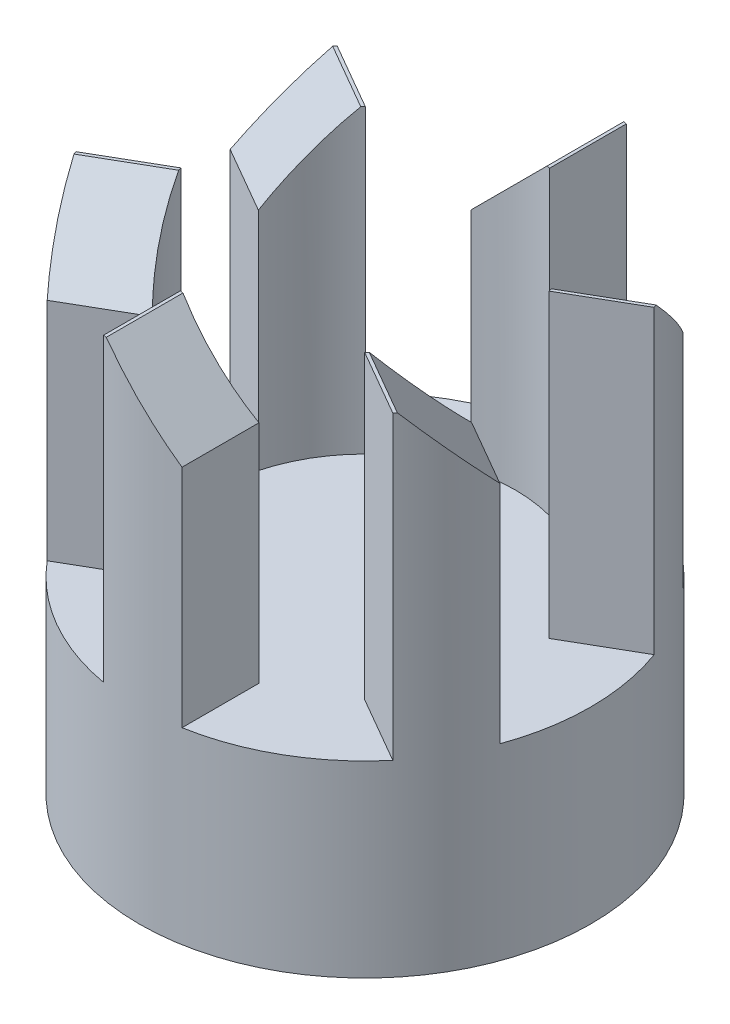
ISO-10303-21;
HEADER;
FILE_DESCRIPTION(('STEP AP214'),'2;1');
FILE_NAME('part.step','',(''),(''),'','','');
FILE_SCHEMA(('AUTOMOTIVE_DESIGN { 1 0 10303 214 1 1 1 1 }'));
ENDSEC;
DATA;
#1=APPLICATION_CONTEXT('core data for automotive mechanical design processes');
#2=APPLICATION_PROTOCOL_DEFINITION('international standard','automotive_design',2000,#1);
#3=PRODUCT_CONTEXT('',#1,'mechanical');
#4=PRODUCT('Part','Part','',(#3));
#5=PRODUCT_RELATED_PRODUCT_CATEGORY('part','',(#4));
#6=PRODUCT_DEFINITION_FORMATION('','',#4);
#7=PRODUCT_DEFINITION_CONTEXT('part definition',#1,'design');
#8=PRODUCT_DEFINITION('design','',#6,#7);
#9=PRODUCT_DEFINITION_SHAPE('','',#8);
#10=(LENGTH_UNIT() NAMED_UNIT(*) SI_UNIT(.MILLI.,.METRE.));
#11=(NAMED_UNIT(*) PLANE_ANGLE_UNIT() SI_UNIT($,.RADIAN.));
#12=(NAMED_UNIT(*) SI_UNIT($,.STERADIAN.) SOLID_ANGLE_UNIT());
#13=UNCERTAINTY_MEASURE_WITH_UNIT(LENGTH_MEASURE(1.E-05),#10,'distance_accuracy_value','');
#14=(GEOMETRIC_REPRESENTATION_CONTEXT(3) GLOBAL_UNCERTAINTY_ASSIGNED_CONTEXT((#13)) GLOBAL_UNIT_ASSIGNED_CONTEXT((#10,
#11,#12)) REPRESENTATION_CONTEXT('',''));
#15=CARTESIAN_POINT('',(0.,0.,0.));
#16=DIRECTION('',(0.,0.,1.));
#17=DIRECTION('',(1.,0.,0.));
#18=AXIS2_PLACEMENT_3D('',#15,#16,#17);
#19=CARTESIAN_POINT('',(0.,5.,0.));
#20=DIRECTION('',(0.,1.,0.));
#21=DIRECTION('',(0.,0.,1.));
#22=AXIS2_PLACEMENT_3D('',#19,#20,#21);
#23=PLANE('',#22);
#24=CARTESIAN_POINT('',(0.,5.,0.));
#25=DIRECTION('',(0.,1.,0.));
#26=DIRECTION('',(0.,0.,1.));
#27=AXIS2_PLACEMENT_3D('',#24,#25,#26);
#28=CIRCLE('',#27,6.);
#29=CARTESIAN_POINT('',(-5.63815572471541,5.,-2.05212085995414));
#30=VERTEX_POINT('',#29);
#31=CARTESIAN_POINT('',(-5.63815572471546,5.,2.05212085995398));
#32=VERTEX_POINT('',#31);
#33=EDGE_CURVE('E473',#30,#32,#28,.T.);
#34=ORIENTED_EDGE('',*,*,#33,.T.);
#35=DIRECTION('',(-0.866025403784447,0.,0.499999999999985));
#36=VECTOR('',#35,1.);
#37=CARTESIAN_POINT('',(-0.520944533000741,5.,-0.902302399082561));
#38=LINE('',#37,#36);
#39=CARTESIAN_POINT('',(-3.86546996729035,5.,1.02866026071602));
#40=VERTEX_POINT('',#39);
#41=EDGE_CURVE('E273',#40,#32,#38,.T.);
#42=ORIENTED_EDGE('',*,*,#41,.F.);
#43=CARTESIAN_POINT('',(0.,5.,0.));
#44=DIRECTION('',(0.,1.,0.));
#45=DIRECTION('',(0.,0.,1.));
#46=AXIS2_PLACEMENT_3D('',#43,#44,#45);
#47=CIRCLE('',#46,4.);
#48=CARTESIAN_POINT('',(-2.82358090128882,5.,2.83326505888118));
#49=VERTEX_POINT('',#48);
#50=EDGE_CURVE('E247',#40,#49,#47,.T.);
#51=ORIENTED_EDGE('',*,*,#50,.T.);
#52=DIRECTION('',(0.866025403784448,0.,-0.499999999999983));
#53=VECTOR('',#52,1.);
#54=CARTESIAN_POINT('',(0.520944533000773,5.,0.902302399082621));
#55=LINE('',#54,#53);
#56=CARTESIAN_POINT('',(-4.59626665871394,5.,3.85672565811915));
#57=VERTEX_POINT('',#56);
#58=EDGE_CURVE('E269',#57,#49,#55,.T.);
#59=ORIENTED_EDGE('',*,*,#58,.F.);
#60=CARTESIAN_POINT('',(-1.0418890660016,5.,5.90884651807324));
#61=VERTEX_POINT('',#60);
#62=EDGE_CURVE('E477',#57,#61,#28,.T.);
#63=ORIENTED_EDGE('',*,*,#62,.T.);
#64=DIRECTION('',(0.,0.,1.));
#65=VECTOR('',#64,1.);
#66=CARTESIAN_POINT('',(-1.04188906600151,5.,0.));
#67=LINE('',#66,#65);
#68=CARTESIAN_POINT('',(-1.04188906600157,5.,3.86192531959726));
#69=VERTEX_POINT('',#68);
#70=EDGE_CURVE('E306',#69,#61,#67,.T.);
#71=ORIENTED_EDGE('',*,*,#70,.F.);
#72=CARTESIAN_POINT('',(0.,5.,0.));
#73=DIRECTION('',(0.,1.,0.));
#74=DIRECTION('',(0.,0.,1.));
#75=AXIS2_PLACEMENT_3D('',#72,#73,#74);
#76=CIRCLE('',#75,4.);
#77=CARTESIAN_POINT('',(1.04188906600151,5.,3.86192531959727));
#78=VERTEX_POINT('',#77);
#79=EDGE_CURVE('E251',#69,#78,#76,.T.);
#80=ORIENTED_EDGE('',*,*,#79,.T.);
#81=DIRECTION('',(0.,0.,-1.));
#82=VECTOR('',#81,1.);
#83=CARTESIAN_POINT('',(1.04188906600158,5.,0.));
#84=LINE('',#83,#82);
#85=CARTESIAN_POINT('',(1.04188906600148,5.,5.90884651807327));
#86=VERTEX_POINT('',#85);
#87=EDGE_CURVE('E295',#86,#78,#84,.T.);
#88=ORIENTED_EDGE('',*,*,#87,.F.);
#89=CARTESIAN_POINT('',(4.59626665871387,5.,3.85672565811924));
#90=VERTEX_POINT('',#89);
#91=EDGE_CURVE('E552',#86,#90,#28,.T.);
#92=ORIENTED_EDGE('',*,*,#91,.T.);
#93=DIRECTION('',(0.866025403784433,0.,0.50000000000001));
#94=VECTOR('',#93,1.);
#95=CARTESIAN_POINT('',(-0.520944533000768,5.,0.902302399082547));
#96=LINE('',#95,#94);
#97=CARTESIAN_POINT('',(2.82358090128878,5.,2.83326505888122));
#98=VERTEX_POINT('',#97);
#99=EDGE_CURVE('E342',#98,#90,#96,.T.);
#100=ORIENTED_EDGE('',*,*,#99,.F.);
#101=CARTESIAN_POINT('',(0.,5.,0.));
#102=DIRECTION('',(0.,1.,0.));
#103=DIRECTION('',(0.,0.,1.));
#104=AXIS2_PLACEMENT_3D('',#101,#102,#103);
#105=CIRCLE('',#104,4.);
#106=CARTESIAN_POINT('',(3.86546996729034,5.,1.02866026071607));
#107=VERTEX_POINT('',#106);
#108=EDGE_CURVE('E326',#98,#107,#105,.T.);
#109=ORIENTED_EDGE('',*,*,#108,.T.);
#110=DIRECTION('',(-0.866025403784431,0.,-0.500000000000013));
#111=VECTOR('',#110,1.);
#112=CARTESIAN_POINT('',(0.520944533000803,5.,-0.902302399082602));
#113=LINE('',#112,#111);
#114=CARTESIAN_POINT('',(5.63815572471542,5.,2.0521208599541));
#115=VERTEX_POINT('',#114);
#116=EDGE_CURVE('E331',#115,#107,#113,.T.);
#117=ORIENTED_EDGE('',*,*,#116,.F.);
#118=CARTESIAN_POINT('',(5.63815572471545,5.,-2.05212085995402));
#119=VERTEX_POINT('',#118);
#120=EDGE_CURVE('E554',#115,#119,#28,.T.);
#121=ORIENTED_EDGE('',*,*,#120,.T.);
#122=DIRECTION('',(0.866025403784444,0.,-0.499999999999991));
#123=VECTOR('',#122,1.);
#124=CARTESIAN_POINT('',(0.520944533000748,5.,0.902302399082557));
#125=LINE('',#124,#123);
#126=CARTESIAN_POINT('',(3.86546996729034,5.,-1.02866026071605));
#127=VERTEX_POINT('',#126);
#128=EDGE_CURVE('E379',#127,#119,#125,.T.);
#129=ORIENTED_EDGE('',*,*,#128,.F.);
#130=CARTESIAN_POINT('',(0.,5.,0.));
#131=DIRECTION('',(0.,1.,0.));
#132=DIRECTION('',(0.,0.,1.));
#133=AXIS2_PLACEMENT_3D('',#130,#131,#132);
#134=CIRCLE('',#133,4.);
#135=CARTESIAN_POINT('',(2.8235809012888,5.,-2.8332650588812));
#136=VERTEX_POINT('',#135);
#137=EDGE_CURVE('E362',#127,#136,#134,.T.);
#138=ORIENTED_EDGE('',*,*,#137,.T.);
#139=DIRECTION('',(-0.866025403784445,0.,0.499999999999989));
#140=VECTOR('',#139,1.);
#141=CARTESIAN_POINT('',(-0.520944533000779,5.,-0.902302399082617));
#142=LINE('',#141,#140);
#143=CARTESIAN_POINT('',(4.59626665871392,5.,-3.85672565811918));
#144=VERTEX_POINT('',#143);
#145=EDGE_CURVE('E368',#144,#136,#142,.T.);
#146=ORIENTED_EDGE('',*,*,#145,.F.);
#147=CARTESIAN_POINT('',(1.04188906600156,5.,-5.90884651807325));
#148=VERTEX_POINT('',#147);
#149=EDGE_CURVE('E556',#144,#148,#28,.T.);
#150=ORIENTED_EDGE('',*,*,#149,.T.);
#151=DIRECTION('',(0.,0.,-1.));
#152=VECTOR('',#151,1.);
#153=CARTESIAN_POINT('',(1.04188906600151,5.,0.));
#154=LINE('',#153,#152);
#155=CARTESIAN_POINT('',(1.04188906600154,5.,-3.86192531959726));
#156=VERTEX_POINT('',#155);
#157=EDGE_CURVE('E416',#156,#148,#154,.T.);
#158=ORIENTED_EDGE('',*,*,#157,.F.);
#159=CARTESIAN_POINT('',(0.,5.,0.));
#160=DIRECTION('',(0.,1.,0.));
#161=DIRECTION('',(0.,0.,1.));
#162=AXIS2_PLACEMENT_3D('',#159,#160,#161);
#163=CIRCLE('',#162,4.);
#164=CARTESIAN_POINT('',(-1.04188906600154,5.,-3.86192531959726));
#165=VERTEX_POINT('',#164);
#166=EDGE_CURVE('E399',#156,#165,#163,.T.);
#167=ORIENTED_EDGE('',*,*,#166,.T.);
#168=DIRECTION('',(0.,0.,1.));
#169=VECTOR('',#168,1.);
#170=CARTESIAN_POINT('',(-1.04188906600158,5.,0.));
#171=LINE('',#170,#169);
#172=CARTESIAN_POINT('',(-1.04188906600152,5.,-5.90884651807326));
#173=VERTEX_POINT('',#172);
#174=EDGE_CURVE('E405',#173,#165,#171,.T.);
#175=ORIENTED_EDGE('',*,*,#174,.F.);
#176=CARTESIAN_POINT('',(-4.59626665871384,5.,-3.85672565811927));
#177=VERTEX_POINT('',#176);
#178=EDGE_CURVE('E478',#173,#177,#28,.T.);
#179=ORIENTED_EDGE('',*,*,#178,.T.);
#180=DIRECTION('',(-0.866025403784429,0.,-0.500000000000017));
#181=VECTOR('',#180,1.);
#182=CARTESIAN_POINT('',(0.520944533000774,5.,-0.902302399082541));
#183=LINE('',#182,#181);
#184=CARTESIAN_POINT('',(-2.82358090128877,5.,-2.83326505888124));
#185=VERTEX_POINT('',#184);
#186=EDGE_CURVE('E452',#185,#177,#183,.T.);
#187=ORIENTED_EDGE('',*,*,#186,.F.);
#188=CARTESIAN_POINT('',(0.,5.,0.));
#189=DIRECTION('',(0.,1.,0.));
#190=DIRECTION('',(0.,0.,1.));
#191=AXIS2_PLACEMENT_3D('',#188,#189,#190);
#192=CIRCLE('',#191,4.);
#193=CARTESIAN_POINT('',(-3.86546996729033,5.,-1.0286602607161));
#194=VERTEX_POINT('',#193);
#195=EDGE_CURVE('E435',#185,#194,#192,.T.);
#196=ORIENTED_EDGE('',*,*,#195,.T.);
#197=DIRECTION('',(0.866025403784428,0.,0.500000000000019));
#198=VECTOR('',#197,1.);
#199=CARTESIAN_POINT('',(-0.520944533000811,5.,0.902302399082601));
#200=LINE('',#199,#198);
#201=EDGE_CURVE('E441',#30,#194,#200,.T.);
#202=ORIENTED_EDGE('',*,*,#201,.F.);
#203=EDGE_LOOP('',(#34,#42,#51,#59,#63,#71,#80,#88,#92,#100,#109,#117,#121,#129,#138,#146,#150,
#158,#167,#175,#179,#187,#196,#202));
#204=FACE_BOUND('',#203,.T.);
#205=ADVANCED_FACE('F43',(#204),#23,.T.);
#206=CARTESIAN_POINT('',(0.,5.,0.));
#207=DIRECTION('',(0.,-1.,0.));
#208=DIRECTION('',(0.,0.,-1.));
#209=AXIS2_PLACEMENT_3D('',#206,#207,#208);
#210=CYLINDRICAL_SURFACE('',#209,6.);
#211=DIRECTION('',(0.,-1.,0.));
#212=VECTOR('',#211,1.);
#213=CARTESIAN_POINT('',(1.04188906600148,13.,5.90884651807327));
#214=LINE('',#213,#212);
#215=CARTESIAN_POINT('',(1.04188906600148,11.,5.90884651807327));
#216=VERTEX_POINT('',#215);
#217=EDGE_CURVE('E315',#216,#86,#214,.T.);
#218=ORIENTED_EDGE('',*,*,#217,.F.);
#219=CARTESIAN_POINT('',(0.,12.0418890660016,0.));
#220=DIRECTION('',(0.707106781186548,0.707106781186547,0.));
#221=DIRECTION('',(0.707106781186547,-0.707106781186548,0.));
#222=AXIS2_PLACEMENT_3D('',#219,#220,#221);
#223=ELLIPSE('',#222,8.48528137423858,6.);
#224=CARTESIAN_POINT('',(-0.95811093399852,13.,5.92300797215));
#225=VERTEX_POINT('',#224);
#226=EDGE_CURVE('E506',#216,#225,#223,.F.);
#227=ORIENTED_EDGE('',*,*,#226,.T.);
#228=CARTESIAN_POINT('',(0.,13.,0.));
#229=DIRECTION('',(0.,1.,0.));
#230=DIRECTION('',(0.,0.,1.));
#231=AXIS2_PLACEMENT_3D('',#228,#229,#230);
#232=CIRCLE('',#231,6.);
#233=CARTESIAN_POINT('',(-1.0418890660016,13.,5.90884651807324));
#234=VERTEX_POINT('',#233);
#235=EDGE_CURVE('E298',#234,#225,#232,.T.);
#236=ORIENTED_EDGE('',*,*,#235,.F.);
#237=DIRECTION('',(0.,-1.,0.));
#238=VECTOR('',#237,1.);
#239=CARTESIAN_POINT('',(-1.0418890660016,13.,5.90884651807324));
#240=LINE('',#239,#238);
#241=EDGE_CURVE('E318',#234,#61,#240,.T.);
#242=ORIENTED_EDGE('',*,*,#241,.T.);
#243=ORIENTED_EDGE('',*,*,#62,.F.);
#244=DIRECTION('',(0.,-1.,0.));
#245=VECTOR('',#244,1.);
#246=CARTESIAN_POINT('',(-4.59626665871394,13.,3.85672565811915));
#247=LINE('',#246,#245);
#248=CARTESIAN_POINT('',(-4.59626665871394,11.,3.85672565811915));
#249=VERTEX_POINT('',#248);
#250=EDGE_CURVE('E285',#249,#57,#247,.T.);
#251=ORIENTED_EDGE('',*,*,#250,.F.);
#252=CARTESIAN_POINT('',(0.,12.0418890660016,0.));
#253=DIRECTION('',(0.353553390593262,0.707106781186546,0.612372435695802));
#254=DIRECTION('',(0.353553390593261,-0.707106781186549,0.6123724356958));
#255=AXIS2_PLACEMENT_3D('',#252,#253,#254);
#256=ELLIPSE('',#255,8.48528137423858,6.);
#257=CARTESIAN_POINT('',(-5.60853083769892,13.,2.13175557758863));
#258=VERTEX_POINT('',#257);
#259=EDGE_CURVE('E503',#249,#258,#256,.F.);
#260=ORIENTED_EDGE('',*,*,#259,.T.);
#261=CARTESIAN_POINT('',(0.,13.,0.));
#262=DIRECTION('',(0.,1.,0.));
#263=DIRECTION('',(0.,0.,1.));
#264=AXIS2_PLACEMENT_3D('',#261,#262,#263);
#265=CIRCLE('',#264,6.);
#266=CARTESIAN_POINT('',(-5.63815572471546,13.,2.05212085995398));
#267=VERTEX_POINT('',#266);
#268=EDGE_CURVE('E262',#267,#258,#265,.T.);
#269=ORIENTED_EDGE('',*,*,#268,.F.);
#270=DIRECTION('',(0.,-1.,0.));
#271=VECTOR('',#270,1.);
#272=CARTESIAN_POINT('',(-5.63815572471546,13.,2.05212085995398));
#273=LINE('',#272,#271);
#274=EDGE_CURVE('E252',#267,#32,#273,.T.);
#275=ORIENTED_EDGE('',*,*,#274,.T.);
#276=ORIENTED_EDGE('',*,*,#33,.F.);
#277=DIRECTION('',(0.,-1.,0.));
#278=VECTOR('',#277,1.);
#279=CARTESIAN_POINT('',(-5.63815572471541,13.,-2.05212085995414));
#280=LINE('',#279,#278);
#281=CARTESIAN_POINT('',(-5.63815572471541,11.,-2.05212085995414));
#282=VERTEX_POINT('',#281);
#283=EDGE_CURVE('E461',#282,#30,#280,.T.);
#284=ORIENTED_EDGE('',*,*,#283,.F.);
#285=CARTESIAN_POINT('',(0.,12.0418890660016,0.));
#286=DIRECTION('',(-0.353553390593288,0.707106781186546,0.612372435695788));
#287=DIRECTION('',(-0.353553390593287,-0.707106781186549,0.612372435695786));
#288=AXIS2_PLACEMENT_3D('',#285,#286,#287);
#289=ELLIPSE('',#288,8.48528137423858,6.);
#290=CARTESIAN_POINT('',(-4.65041990370037,13.,-3.79125239456138));
#291=VERTEX_POINT('',#290);
#292=EDGE_CURVE('E500',#282,#291,#289,.F.);
#293=ORIENTED_EDGE('',*,*,#292,.T.);
#294=CARTESIAN_POINT('',(0.,13.,0.));
#295=DIRECTION('',(0.,1.,0.));
#296=DIRECTION('',(0.,0.,1.));
#297=AXIS2_PLACEMENT_3D('',#294,#295,#296);
#298=CIRCLE('',#297,6.);
#299=CARTESIAN_POINT('',(-4.59626665871384,13.,-3.85672565811927));
#300=VERTEX_POINT('',#299);
#301=EDGE_CURVE('E444',#300,#291,#298,.T.);
#302=ORIENTED_EDGE('',*,*,#301,.F.);
#303=DIRECTION('',(0.,-1.,0.));
#304=VECTOR('',#303,1.);
#305=CARTESIAN_POINT('',(-4.59626665871384,13.,-3.85672565811927));
#306=LINE('',#305,#304);
#307=EDGE_CURVE('E464',#300,#177,#306,.T.);
#308=ORIENTED_EDGE('',*,*,#307,.T.);
#309=ORIENTED_EDGE('',*,*,#178,.F.);
#310=DIRECTION('',(0.,-1.,0.));
#311=VECTOR('',#310,1.);
#312=CARTESIAN_POINT('',(-1.04188906600152,13.,-5.90884651807326));
#313=LINE('',#312,#311);
#314=CARTESIAN_POINT('',(-1.04188906600152,11.,-5.90884651807326));
#315=VERTEX_POINT('',#314);
#316=EDGE_CURVE('E425',#315,#173,#313,.T.);
#317=ORIENTED_EDGE('',*,*,#316,.F.);
#318=CARTESIAN_POINT('',(0.,12.0418890660016,0.));
#319=DIRECTION('',(-0.707106781186548,0.707106781186546,0.));
#320=DIRECTION('',(-0.707106781186547,-0.707106781186549,0.));
#321=AXIS2_PLACEMENT_3D('',#318,#319,#320);
#322=ELLIPSE('',#321,8.48528137423858,6.);
#323=CARTESIAN_POINT('',(0.958110933998478,13.,-5.92300797215001));
#324=VERTEX_POINT('',#323);
#325=EDGE_CURVE('E497',#315,#324,#322,.F.);
#326=ORIENTED_EDGE('',*,*,#325,.T.);
#327=CARTESIAN_POINT('',(0.,13.,0.));
#328=DIRECTION('',(0.,1.,0.));
#329=DIRECTION('',(0.,0.,1.));
#330=AXIS2_PLACEMENT_3D('',#327,#328,#329);
#331=CIRCLE('',#330,6.);
#332=CARTESIAN_POINT('',(1.04188906600156,13.,-5.90884651807325));
#333=VERTEX_POINT('',#332);
#334=EDGE_CURVE('E408',#333,#324,#331,.T.);
#335=ORIENTED_EDGE('',*,*,#334,.F.);
#336=DIRECTION('',(0.,-1.,0.));
#337=VECTOR('',#336,1.);
#338=CARTESIAN_POINT('',(1.04188906600156,13.,-5.90884651807325));
#339=LINE('',#338,#337);
#340=EDGE_CURVE('E428',#333,#148,#339,.T.);
#341=ORIENTED_EDGE('',*,*,#340,.T.);
#342=ORIENTED_EDGE('',*,*,#149,.F.);
#343=DIRECTION('',(0.,-1.,0.));
#344=VECTOR('',#343,1.);
#345=CARTESIAN_POINT('',(4.59626665871392,13.,-3.85672565811918));
#346=LINE('',#345,#344);
#347=CARTESIAN_POINT('',(4.59626665871392,11.,-3.85672565811918));
#348=VERTEX_POINT('',#347);
#349=EDGE_CURVE('E388',#348,#144,#346,.T.);
#350=ORIENTED_EDGE('',*,*,#349,.F.);
#351=CARTESIAN_POINT('',(0.,12.0418890660016,0.));
#352=DIRECTION('',(-0.353553390593267,0.707106781186546,-0.6123724356958));
#353=DIRECTION('',(-0.353553390593266,-0.707106781186549,-0.612372435695798));
#354=AXIS2_PLACEMENT_3D('',#351,#352,#353);
#355=ELLIPSE('',#354,8.48528137423858,6.);
#356=CARTESIAN_POINT('',(5.6085308376989,13.,-2.13175557758867));
#357=VERTEX_POINT('',#356);
#358=EDGE_CURVE('E494',#348,#357,#355,.F.);
#359=ORIENTED_EDGE('',*,*,#358,.T.);
#360=CARTESIAN_POINT('',(0.,13.,0.));
#361=DIRECTION('',(0.,1.,0.));
#362=DIRECTION('',(0.,0.,1.));
#363=AXIS2_PLACEMENT_3D('',#360,#361,#362);
#364=CIRCLE('',#363,6.);
#365=CARTESIAN_POINT('',(5.63815572471545,13.,-2.05212085995402));
#366=VERTEX_POINT('',#365);
#367=EDGE_CURVE('E371',#366,#357,#364,.T.);
#368=ORIENTED_EDGE('',*,*,#367,.F.);
#369=DIRECTION('',(0.,-1.,0.));
#370=VECTOR('',#369,1.);
#371=CARTESIAN_POINT('',(5.63815572471545,13.,-2.05212085995402));
#372=LINE('',#371,#370);
#373=EDGE_CURVE('E391',#366,#119,#372,.T.);
#374=ORIENTED_EDGE('',*,*,#373,.T.);
#375=ORIENTED_EDGE('',*,*,#120,.F.);
#376=DIRECTION('',(0.,-1.,0.));
#377=VECTOR('',#376,1.);
#378=CARTESIAN_POINT('',(5.63815572471542,13.,2.0521208599541));
#379=LINE('',#378,#377);
#380=CARTESIAN_POINT('',(5.63815572471542,11.,2.0521208599541));
#381=VERTEX_POINT('',#380);
#382=EDGE_CURVE('E351',#381,#115,#379,.T.);
#383=ORIENTED_EDGE('',*,*,#382,.F.);
#384=CARTESIAN_POINT('',(0.,12.0418890660016,0.));
#385=DIRECTION('',(0.353553390593283,0.707106781186547,-0.61237243569579));
#386=DIRECTION('',(0.353553390593282,-0.707106781186548,-0.612372435695789));
#387=AXIS2_PLACEMENT_3D('',#384,#385,#386);
#388=ELLIPSE('',#387,8.48528137423858,6.);
#389=CARTESIAN_POINT('',(4.6504199037004,13.,3.79125239456134));
#390=VERTEX_POINT('',#389);
#391=EDGE_CURVE('E491',#381,#390,#388,.F.);
#392=ORIENTED_EDGE('',*,*,#391,.T.);
#393=CARTESIAN_POINT('',(0.,13.,0.));
#394=DIRECTION('',(0.,1.,0.));
#395=DIRECTION('',(0.,0.,1.));
#396=AXIS2_PLACEMENT_3D('',#393,#394,#395);
#397=CIRCLE('',#396,6.);
#398=CARTESIAN_POINT('',(4.59626665871387,13.,3.85672565811924));
#399=VERTEX_POINT('',#398);
#400=EDGE_CURVE('E334',#399,#390,#397,.T.);
#401=ORIENTED_EDGE('',*,*,#400,.F.);
#402=DIRECTION('',(0.,-1.,0.));
#403=VECTOR('',#402,1.);
#404=CARTESIAN_POINT('',(4.59626665871387,13.,3.85672565811924));
#405=LINE('',#404,#403);
#406=EDGE_CURVE('E354',#399,#90,#405,.T.);
#407=ORIENTED_EDGE('',*,*,#406,.T.);
#408=ORIENTED_EDGE('',*,*,#91,.F.);
#409=EDGE_LOOP('',(#218,#227,#236,#242,#243,#251,#260,#269,#275,#276,#284,#293,#302,#308,#309,
#317,#326,#335,#341,#342,#350,#359,#368,#374,#375,#383,#392,#401,#407,#408));
#410=FACE_BOUND('',#409,.T.);
#411=CARTESIAN_POINT('',(0.,0.,0.));
#412=DIRECTION('',(0.,1.,0.));
#413=DIRECTION('',(0.,0.,1.));
#414=AXIS2_PLACEMENT_3D('',#411,#412,#413);
#415=CIRCLE('',#414,6.);
#416=CARTESIAN_POINT('',(0.,0.,6.));
#417=VERTEX_POINT('',#416);
#418=EDGE_CURVE('E472',#417,#417,#415,.T.);
#419=ORIENTED_EDGE('',*,*,#418,.T.);
#420=EDGE_LOOP('',(#419));
#421=FACE_BOUND('',#420,.T.);
#422=ADVANCED_FACE('F570',(#410,#421),#210,.T.);
#423=CARTESIAN_POINT('',(0.,0.,0.));
#424=DIRECTION('',(0.,1.,0.));
#425=DIRECTION('',(0.,0.,1.));
#426=AXIS2_PLACEMENT_3D('',#423,#424,#425);
#427=PLANE('',#426);
#428=ORIENTED_EDGE('',*,*,#418,.F.);
#429=EDGE_LOOP('',(#428));
#430=FACE_BOUND('',#429,.T.);
#431=ADVANCED_FACE('F653',(#430),#427,.F.);
#432=CARTESIAN_POINT('',(0.,13.,0.));
#433=DIRECTION('',(0.,-1.,0.));
#434=DIRECTION('',(0.,0.,-1.));
#435=AXIS2_PLACEMENT_3D('',#432,#433,#434);
#436=CYLINDRICAL_SURFACE('',#435,4.);
#437=CARTESIAN_POINT('',(0.,13.,0.));
#438=DIRECTION('',(0.,1.,0.));
#439=DIRECTION('',(0.,0.,1.));
#440=AXIS2_PLACEMENT_3D('',#437,#438,#439);
#441=CIRCLE('',#440,4.);
#442=CARTESIAN_POINT('',(-2.82358090128877,13.,-2.83326505888124));
#443=VERTEX_POINT('',#442);
#444=CARTESIAN_POINT('',(-2.88420449598523,13.,-2.77152745347012));
#445=VERTEX_POINT('',#444);
#446=EDGE_CURVE('E436',#443,#445,#441,.T.);
#447=ORIENTED_EDGE('',*,*,#446,.T.);
#448=CARTESIAN_POINT('',(0.,12.0418890660016,0.));
#449=DIRECTION('',(-0.353553390593288,0.707106781186546,0.612372435695788));
#450=DIRECTION('',(-0.353553390593287,-0.707106781186549,0.612372435695786));
#451=AXIS2_PLACEMENT_3D('',#448,#449,#450);
#452=ELLIPSE('',#451,5.65685424949239,4.);
#453=CARTESIAN_POINT('',(-3.86546996729033,11.,-1.0286602607161));
#454=VERTEX_POINT('',#453);
#455=EDGE_CURVE('E521',#445,#454,#452,.T.);
#456=ORIENTED_EDGE('',*,*,#455,.T.);
#457=DIRECTION('',(0.,-1.,0.));
#458=VECTOR('',#457,1.);
#459=CARTESIAN_POINT('',(-3.86546996729033,13.,-1.0286602607161));
#460=LINE('',#459,#458);
#461=EDGE_CURVE('E448',#454,#194,#460,.T.);
#462=ORIENTED_EDGE('',*,*,#461,.T.);
#463=ORIENTED_EDGE('',*,*,#195,.F.);
#464=DIRECTION('',(0.,-1.,0.));
#465=VECTOR('',#464,1.);
#466=CARTESIAN_POINT('',(-2.82358090128877,13.,-2.83326505888124));
#467=LINE('',#466,#465);
#468=EDGE_CURVE('E468',#443,#185,#467,.T.);
#469=ORIENTED_EDGE('',*,*,#468,.F.);
#470=EDGE_LOOP('',(#447,#456,#462,#463,#469));
#471=FACE_BOUND('',#470,.T.);
#472=ADVANCED_FACE('F583',(#471),#436,.F.);
#473=CARTESIAN_POINT('',(0.520944533000774,13.,-0.902302399082541));
#474=DIRECTION('',(-0.500000000000017,0.,0.866025403784429));
#475=DIRECTION('',(0.866025403784429,0.,0.500000000000017));
#476=AXIS2_PLACEMENT_3D('',#473,#474,#475);
#477=PLANE('',#476);
#478=ORIENTED_EDGE('',*,*,#186,.T.);
#479=ORIENTED_EDGE('',*,*,#307,.F.);
#480=DIRECTION('',(-0.866025403784429,0.,-0.500000000000017));
#481=VECTOR('',#480,1.);
#482=CARTESIAN_POINT('',(0.520944533000774,13.,-0.902302399082541));
#483=LINE('',#482,#481);
#484=EDGE_CURVE('E440',#443,#300,#483,.T.);
#485=ORIENTED_EDGE('',*,*,#484,.F.);
#486=ORIENTED_EDGE('',*,*,#468,.T.);
#487=EDGE_LOOP('',(#478,#479,#485,#486));
#488=FACE_BOUND('',#487,.T.);
#489=ADVANCED_FACE('F565',(#488),#477,.F.);
#490=CARTESIAN_POINT('',(-0.520944533000811,13.,0.902302399082601));
#491=DIRECTION('',(0.500000000000019,0.,-0.866025403784428));
#492=DIRECTION('',(-0.866025403784428,0.,-0.500000000000019));
#493=AXIS2_PLACEMENT_3D('',#490,#491,#492);
#494=PLANE('',#493);
#495=ORIENTED_EDGE('',*,*,#461,.F.);
#496=DIRECTION('',(-0.866025403784428,0.,-0.500000000000019));
#497=VECTOR('',#496,1.);
#498=CARTESIAN_POINT('',(-5.63815572471541,11.,-2.05212085995414));
#499=LINE('',#498,#497);
#500=EDGE_CURVE('E524',#454,#282,#499,.T.);
#501=ORIENTED_EDGE('',*,*,#500,.T.);
#502=ORIENTED_EDGE('',*,*,#283,.T.);
#503=ORIENTED_EDGE('',*,*,#201,.T.);
#504=EDGE_LOOP('',(#495,#501,#502,#503));
#505=FACE_BOUND('',#504,.T.);
#506=ADVANCED_FACE('F585',(#505),#494,.F.);
#507=CARTESIAN_POINT('',(0.,13.,0.));
#508=DIRECTION('',(0.,1.,0.));
#509=DIRECTION('',(0.,0.,1.));
#510=AXIS2_PLACEMENT_3D('',#507,#508,#509);
#511=PLANE('',#510);
#512=ORIENTED_EDGE('',*,*,#301,.T.);
#513=DIRECTION('',(0.866025403784428,0.,0.500000000000019));
#514=VECTOR('',#513,1.);
#515=CARTESIAN_POINT('',(-2.86546996729029,13.,-2.76071106828496));
#516=LINE('',#515,#514);
#517=EDGE_CURVE('E517',#291,#445,#516,.T.);
#518=ORIENTED_EDGE('',*,*,#517,.T.);
#519=ORIENTED_EDGE('',*,*,#446,.F.);
#520=ORIENTED_EDGE('',*,*,#484,.T.);
#521=EDGE_LOOP('',(#512,#518,#519,#520));
#522=FACE_BOUND('',#521,.T.);
#523=ADVANCED_FACE('F576',(#522),#511,.T.);
#524=CARTESIAN_POINT('',(0.,13.,0.));
#525=DIRECTION('',(0.,-1.,0.));
#526=DIRECTION('',(0.,0.,-1.));
#527=AXIS2_PLACEMENT_3D('',#524,#525,#526);
#528=CYLINDRICAL_SURFACE('',#527,4.);
#529=CARTESIAN_POINT('',(0.,13.,0.));
#530=DIRECTION('',(0.,1.,0.));
#531=DIRECTION('',(0.,0.,1.));
#532=AXIS2_PLACEMENT_3D('',#529,#530,#531);
#533=CIRCLE('',#532,4.);
#534=CARTESIAN_POINT('',(1.04188906600154,13.,-3.86192531959726));
#535=VERTEX_POINT('',#534);
#536=CARTESIAN_POINT('',(0.958110933998458,13.,-3.88355808996758));
#537=VERTEX_POINT('',#536);
#538=EDGE_CURVE('E400',#535,#537,#533,.T.);
#539=ORIENTED_EDGE('',*,*,#538,.T.);
#540=CARTESIAN_POINT('',(0.,12.0418890660016,0.));
#541=DIRECTION('',(-0.707106781186548,0.707106781186546,0.));
#542=DIRECTION('',(-0.707106781186547,-0.707106781186549,0.));
#543=AXIS2_PLACEMENT_3D('',#540,#541,#542);
#544=ELLIPSE('',#543,5.65685424949239,4.);
#545=CARTESIAN_POINT('',(-1.04188906600154,11.,-3.86192531959726));
#546=VERTEX_POINT('',#545);
#547=EDGE_CURVE('E531',#537,#546,#544,.T.);
#548=ORIENTED_EDGE('',*,*,#547,.T.);
#549=DIRECTION('',(0.,-1.,0.));
#550=VECTOR('',#549,1.);
#551=CARTESIAN_POINT('',(-1.04188906600154,13.,-3.86192531959726));
#552=LINE('',#551,#550);
#553=EDGE_CURVE('E412',#546,#165,#552,.T.);
#554=ORIENTED_EDGE('',*,*,#553,.T.);
#555=ORIENTED_EDGE('',*,*,#166,.F.);
#556=DIRECTION('',(0.,-1.,0.));
#557=VECTOR('',#556,1.);
#558=CARTESIAN_POINT('',(1.04188906600154,13.,-3.86192531959726));
#559=LINE('',#558,#557);
#560=EDGE_CURVE('E432',#535,#156,#559,.T.);
#561=ORIENTED_EDGE('',*,*,#560,.F.);
#562=EDGE_LOOP('',(#539,#548,#554,#555,#561));
#563=FACE_BOUND('',#562,.T.);
#564=ADVANCED_FACE('F714',(#563),#528,.F.);
#565=CARTESIAN_POINT('',(1.04188906600151,13.,0.));
#566=DIRECTION('',(-1.,0.,0.));
#567=DIRECTION('',(0.,0.,1.));
#568=AXIS2_PLACEMENT_3D('',#565,#566,#567);
#569=PLANE('',#568);
#570=ORIENTED_EDGE('',*,*,#157,.T.);
#571=ORIENTED_EDGE('',*,*,#340,.F.);
#572=DIRECTION('',(0.,0.,-1.));
#573=VECTOR('',#572,1.);
#574=CARTESIAN_POINT('',(1.04188906600151,13.,0.));
#575=LINE('',#574,#573);
#576=EDGE_CURVE('E404',#535,#333,#575,.T.);
#577=ORIENTED_EDGE('',*,*,#576,.F.);
#578=ORIENTED_EDGE('',*,*,#560,.T.);
#579=EDGE_LOOP('',(#570,#571,#577,#578));
#580=FACE_BOUND('',#579,.T.);
#581=ADVANCED_FACE('F709',(#580),#569,.F.);
#582=CARTESIAN_POINT('',(-1.04188906600158,13.,0.));
#583=DIRECTION('',(1.,0.,0.));
#584=DIRECTION('',(0.,0.,-1.));
#585=AXIS2_PLACEMENT_3D('',#582,#583,#584);
#586=PLANE('',#585);
#587=ORIENTED_EDGE('',*,*,#553,.F.);
#588=DIRECTION('',(0.,0.,-1.));
#589=VECTOR('',#588,1.);
#590=CARTESIAN_POINT('',(-1.04188906600152,11.,-5.90884651807326));
#591=LINE('',#590,#589);
#592=EDGE_CURVE('E534',#546,#315,#591,.T.);
#593=ORIENTED_EDGE('',*,*,#592,.T.);
#594=ORIENTED_EDGE('',*,*,#316,.T.);
#595=ORIENTED_EDGE('',*,*,#174,.T.);
#596=EDGE_LOOP('',(#587,#593,#594,#595));
#597=FACE_BOUND('',#596,.T.);
#598=ADVANCED_FACE('F718',(#597),#586,.F.);
#599=CARTESIAN_POINT('',(0.,13.,0.));
#600=DIRECTION('',(0.,1.,0.));
#601=DIRECTION('',(0.,0.,1.));
#602=AXIS2_PLACEMENT_3D('',#599,#600,#601);
#603=PLANE('',#602);
#604=ORIENTED_EDGE('',*,*,#334,.T.);
#605=DIRECTION('',(0.,0.,1.));
#606=VECTOR('',#605,1.);
#607=CARTESIAN_POINT('',(0.958110933998458,13.,-3.86192531959724));
#608=LINE('',#607,#606);
#609=EDGE_CURVE('E527',#324,#537,#608,.T.);
#610=ORIENTED_EDGE('',*,*,#609,.T.);
#611=ORIENTED_EDGE('',*,*,#538,.F.);
#612=ORIENTED_EDGE('',*,*,#576,.T.);
#613=EDGE_LOOP('',(#604,#610,#611,#612));
#614=FACE_BOUND('',#613,.T.);
#615=ADVANCED_FACE('F722',(#614),#603,.T.);
#616=CARTESIAN_POINT('',(0.,13.,0.));
#617=DIRECTION('',(0.,-1.,0.));
#618=DIRECTION('',(0.,0.,-1.));
#619=AXIS2_PLACEMENT_3D('',#616,#617,#618);
#620=CYLINDRICAL_SURFACE('',#619,4.);
#621=CARTESIAN_POINT('',(0.,13.,0.));
#622=DIRECTION('',(0.,1.,0.));
#623=DIRECTION('',(0.,0.,1.));
#624=AXIS2_PLACEMENT_3D('',#621,#622,#623);
#625=CIRCLE('',#624,4.);
#626=CARTESIAN_POINT('',(3.86546996729034,13.,-1.02866026071605));
#627=VERTEX_POINT('',#626);
#628=CARTESIAN_POINT('',(3.84231542998372,13.,-1.11203063649748));
#629=VERTEX_POINT('',#628);
#630=EDGE_CURVE('E363',#627,#629,#625,.T.);
#631=ORIENTED_EDGE('',*,*,#630,.T.);
#632=CARTESIAN_POINT('',(0.,12.0418890660016,0.));
#633=DIRECTION('',(-0.353553390593267,0.707106781186546,-0.6123724356958));
#634=DIRECTION('',(-0.353553390593266,-0.707106781186549,-0.612372435695798));
#635=AXIS2_PLACEMENT_3D('',#632,#633,#634);
#636=ELLIPSE('',#635,5.65685424949239,4.);
#637=CARTESIAN_POINT('',(2.8235809012888,11.,-2.8332650588812));
#638=VERTEX_POINT('',#637);
#639=EDGE_CURVE('E541',#629,#638,#636,.T.);
#640=ORIENTED_EDGE('',*,*,#639,.T.);
#641=DIRECTION('',(0.,-1.,0.));
#642=VECTOR('',#641,1.);
#643=CARTESIAN_POINT('',(2.8235809012888,13.,-2.8332650588812));
#644=LINE('',#643,#642);
#645=EDGE_CURVE('E375',#638,#136,#644,.T.);
#646=ORIENTED_EDGE('',*,*,#645,.T.);
#647=ORIENTED_EDGE('',*,*,#137,.F.);
#648=DIRECTION('',(0.,-1.,0.));
#649=VECTOR('',#648,1.);
#650=CARTESIAN_POINT('',(3.86546996729034,13.,-1.02866026071605));
#651=LINE('',#650,#649);
#652=EDGE_CURVE('E395',#627,#127,#651,.T.);
#653=ORIENTED_EDGE('',*,*,#652,.F.);
#654=EDGE_LOOP('',(#631,#640,#646,#647,#653));
#655=FACE_BOUND('',#654,.T.);
#656=ADVANCED_FACE('F724',(#655),#620,.F.);
#657=CARTESIAN_POINT('',(0.520944533000748,13.,0.902302399082557));
#658=DIRECTION('',(-0.499999999999991,0.,-0.866025403784444));
#659=DIRECTION('',(-0.866025403784444,0.,0.499999999999991));
#660=AXIS2_PLACEMENT_3D('',#657,#658,#659);
#661=PLANE('',#660);
#662=ORIENTED_EDGE('',*,*,#128,.T.);
#663=ORIENTED_EDGE('',*,*,#373,.F.);
#664=DIRECTION('',(0.866025403784444,0.,-0.499999999999991));
#665=VECTOR('',#664,1.);
#666=CARTESIAN_POINT('',(0.520944533000748,13.,0.902302399082557));
#667=LINE('',#666,#665);
#668=EDGE_CURVE('E367',#627,#366,#667,.T.);
#669=ORIENTED_EDGE('',*,*,#668,.F.);
#670=ORIENTED_EDGE('',*,*,#652,.T.);
#671=EDGE_LOOP('',(#662,#663,#669,#670));
#672=FACE_BOUND('',#671,.T.);
#673=ADVANCED_FACE('F699',(#672),#661,.F.);
#674=CARTESIAN_POINT('',(-0.520944533000779,13.,-0.902302399082617));
#675=DIRECTION('',(0.499999999999989,0.,0.866025403784445));
#676=DIRECTION('',(0.866025403784445,0.,-0.499999999999989));
#677=AXIS2_PLACEMENT_3D('',#674,#675,#676);
#678=PLANE('',#677);
#679=ORIENTED_EDGE('',*,*,#645,.F.);
#680=DIRECTION('',(0.866025403784445,0.,-0.499999999999989));
#681=VECTOR('',#680,1.);
#682=CARTESIAN_POINT('',(4.59626665871392,11.,-3.85672565811918));
#683=LINE('',#682,#681);
#684=EDGE_CURVE('E544',#638,#348,#683,.T.);
#685=ORIENTED_EDGE('',*,*,#684,.T.);
#686=ORIENTED_EDGE('',*,*,#349,.T.);
#687=ORIENTED_EDGE('',*,*,#145,.T.);
#688=EDGE_LOOP('',(#679,#685,#686,#687));
#689=FACE_BOUND('',#688,.T.);
#690=ADVANCED_FACE('F645',(#689),#678,.F.);
#691=CARTESIAN_POINT('',(0.,13.,0.));
#692=DIRECTION('',(0.,1.,0.));
#693=DIRECTION('',(0.,0.,1.));
#694=AXIS2_PLACEMENT_3D('',#691,#692,#693);
#695=PLANE('',#694);
#696=ORIENTED_EDGE('',*,*,#367,.T.);
#697=DIRECTION('',(-0.866025403784445,0.,0.499999999999989));
#698=VECTOR('',#697,1.);
#699=CARTESIAN_POINT('',(3.82358090128878,13.,-1.10121425131231));
#700=LINE('',#699,#698);
#701=EDGE_CURVE('E537',#357,#629,#700,.T.);
#702=ORIENTED_EDGE('',*,*,#701,.T.);
#703=ORIENTED_EDGE('',*,*,#630,.F.);
#704=ORIENTED_EDGE('',*,*,#668,.T.);
#705=EDGE_LOOP('',(#696,#702,#703,#704));
#706=FACE_BOUND('',#705,.T.);
#707=ADVANCED_FACE('F638',(#706),#695,.T.);
#708=CARTESIAN_POINT('',(0.,13.,0.));
#709=DIRECTION('',(0.,-1.,0.));
#710=DIRECTION('',(0.,0.,-1.));
#711=AXIS2_PLACEMENT_3D('',#708,#709,#710);
#712=CYLINDRICAL_SURFACE('',#711,4.);
#713=CARTESIAN_POINT('',(0.,13.,0.));
#714=DIRECTION('',(0.,1.,0.));
#715=DIRECTION('',(0.,0.,1.));
#716=AXIS2_PLACEMENT_3D('',#713,#714,#715);
#717=CIRCLE('',#716,4.);
#718=CARTESIAN_POINT('',(2.82358090128879,13.,2.83326505888122));
#719=VERTEX_POINT('',#718);
#720=CARTESIAN_POINT('',(2.88420449598525,13.,2.7715274534701));
#721=VERTEX_POINT('',#720);
#722=EDGE_CURVE('E327',#719,#721,#717,.T.);
#723=ORIENTED_EDGE('',*,*,#722,.T.);
#724=CARTESIAN_POINT('',(0.,12.0418890660016,0.));
#725=DIRECTION('',(0.353553390593283,0.707106781186547,-0.61237243569579));
#726=DIRECTION('',(0.353553390593282,-0.707106781186548,-0.612372435695789));
#727=AXIS2_PLACEMENT_3D('',#724,#725,#726);
#728=ELLIPSE('',#727,5.65685424949239,4.);
#729=CARTESIAN_POINT('',(3.86546996729034,11.,1.02866026071607));
#730=VERTEX_POINT('',#729);
#731=EDGE_CURVE('E53',#721,#730,#728,.T.);
#732=ORIENTED_EDGE('',*,*,#731,.T.);
#733=DIRECTION('',(0.,-1.,0.));
#734=VECTOR('',#733,1.);
#735=CARTESIAN_POINT('',(3.86546996729034,13.,1.02866026071607));
#736=LINE('',#735,#734);
#737=EDGE_CURVE('E338',#730,#107,#736,.T.);
#738=ORIENTED_EDGE('',*,*,#737,.T.);
#739=ORIENTED_EDGE('',*,*,#108,.F.);
#740=DIRECTION('',(0.,-1.,0.));
#741=VECTOR('',#740,1.);
#742=CARTESIAN_POINT('',(2.82358090128879,13.,2.83326505888122));
#743=LINE('',#742,#741);
#744=EDGE_CURVE('E358',#719,#98,#743,.T.);
#745=ORIENTED_EDGE('',*,*,#744,.F.);
#746=EDGE_LOOP('',(#723,#732,#738,#739,#745));
#747=FACE_BOUND('',#746,.T.);
#748=ADVANCED_FACE('F636',(#747),#712,.F.);
#749=CARTESIAN_POINT('',(-0.520944533000768,13.,0.902302399082547));
#750=DIRECTION('',(0.50000000000001,0.,-0.866025403784433));
#751=DIRECTION('',(-0.866025403784433,0.,-0.50000000000001));
#752=AXIS2_PLACEMENT_3D('',#749,#750,#751);
#753=PLANE('',#752);
#754=ORIENTED_EDGE('',*,*,#99,.T.);
#755=ORIENTED_EDGE('',*,*,#406,.F.);
#756=DIRECTION('',(0.866025403784433,0.,0.50000000000001));
#757=VECTOR('',#756,1.);
#758=CARTESIAN_POINT('',(-0.520944533000768,13.,0.902302399082547));
#759=LINE('',#758,#757);
#760=EDGE_CURVE('E330',#719,#399,#759,.T.);
#761=ORIENTED_EDGE('',*,*,#760,.F.);
#762=ORIENTED_EDGE('',*,*,#744,.T.);
#763=EDGE_LOOP('',(#754,#755,#761,#762));
#764=FACE_BOUND('',#763,.T.);
#765=ADVANCED_FACE('F621',(#764),#753,.F.);
#766=CARTESIAN_POINT('',(0.520944533000803,13.,-0.902302399082602));
#767=DIRECTION('',(-0.500000000000013,0.,0.866025403784431));
#768=DIRECTION('',(0.866025403784431,0.,0.500000000000013));
#769=AXIS2_PLACEMENT_3D('',#766,#767,#768);
#770=PLANE('',#769);
#771=ORIENTED_EDGE('',*,*,#737,.F.);
#772=DIRECTION('',(0.866025403784431,0.,0.500000000000013));
#773=VECTOR('',#772,1.);
#774=CARTESIAN_POINT('',(5.63815572471542,11.,2.0521208599541));
#775=LINE('',#774,#773);
#776=EDGE_CURVE('E11',#730,#381,#775,.T.);
#777=ORIENTED_EDGE('',*,*,#776,.T.);
#778=ORIENTED_EDGE('',*,*,#382,.T.);
#779=ORIENTED_EDGE('',*,*,#116,.T.);
#780=EDGE_LOOP('',(#771,#777,#778,#779));
#781=FACE_BOUND('',#780,.T.);
#782=ADVANCED_FACE('F631',(#781),#770,.F.);
#783=CARTESIAN_POINT('',(0.,13.,0.));
#784=DIRECTION('',(0.,1.,0.));
#785=DIRECTION('',(0.,0.,1.));
#786=AXIS2_PLACEMENT_3D('',#783,#784,#785);
#787=PLANE('',#786);
#788=ORIENTED_EDGE('',*,*,#400,.T.);
#789=DIRECTION('',(-0.866025403784431,0.,-0.500000000000013));
#790=VECTOR('',#789,1.);
#791=CARTESIAN_POINT('',(2.86546996729031,13.,2.76071106828494));
#792=LINE('',#791,#790);
#793=EDGE_CURVE('E547',#390,#721,#792,.T.);
#794=ORIENTED_EDGE('',*,*,#793,.T.);
#795=ORIENTED_EDGE('',*,*,#722,.F.);
#796=ORIENTED_EDGE('',*,*,#760,.T.);
#797=EDGE_LOOP('',(#788,#794,#795,#796));
#798=FACE_BOUND('',#797,.T.);
#799=ADVANCED_FACE('F628',(#798),#787,.T.);
#800=CARTESIAN_POINT('',(0.,13.,0.));
#801=DIRECTION('',(0.,-1.,0.));
#802=DIRECTION('',(0.,0.,-1.));
#803=AXIS2_PLACEMENT_3D('',#800,#801,#802);
#804=CYLINDRICAL_SURFACE('',#803,4.);
#805=CARTESIAN_POINT('',(0.,13.,0.));
#806=DIRECTION('',(0.,1.,0.));
#807=DIRECTION('',(0.,0.,1.));
#808=AXIS2_PLACEMENT_3D('',#805,#806,#807);
#809=CIRCLE('',#808,4.);
#810=CARTESIAN_POINT('',(-1.04188906600157,13.,3.86192531959726));
#811=VERTEX_POINT('',#810);
#812=CARTESIAN_POINT('',(-0.958110933998485,13.,3.88355808996757));
#813=VERTEX_POINT('',#812);
#814=EDGE_CURVE('E290',#811,#813,#809,.T.);
#815=ORIENTED_EDGE('',*,*,#814,.T.);
#816=CARTESIAN_POINT('',(0.,12.0418890660016,0.));
#817=DIRECTION('',(0.707106781186548,0.707106781186547,0.));
#818=DIRECTION('',(0.707106781186547,-0.707106781186548,0.));
#819=AXIS2_PLACEMENT_3D('',#816,#817,#818);
#820=ELLIPSE('',#819,5.65685424949239,4.);
#821=CARTESIAN_POINT('',(1.04188906600151,11.,3.86192531959727));
#822=VERTEX_POINT('',#821);
#823=EDGE_CURVE('E485',#813,#822,#820,.T.);
#824=ORIENTED_EDGE('',*,*,#823,.T.);
#825=DIRECTION('',(0.,-1.,0.));
#826=VECTOR('',#825,1.);
#827=CARTESIAN_POINT('',(1.04188906600151,13.,3.86192531959727));
#828=LINE('',#827,#826);
#829=EDGE_CURVE('E302',#822,#78,#828,.T.);
#830=ORIENTED_EDGE('',*,*,#829,.T.);
#831=ORIENTED_EDGE('',*,*,#79,.F.);
#832=DIRECTION('',(0.,-1.,0.));
#833=VECTOR('',#832,1.);
#834=CARTESIAN_POINT('',(-1.04188906600157,13.,3.86192531959726));
#835=LINE('',#834,#833);
#836=EDGE_CURVE('E322',#811,#69,#835,.T.);
#837=ORIENTED_EDGE('',*,*,#836,.F.);
#838=EDGE_LOOP('',(#815,#824,#830,#831,#837));
#839=FACE_BOUND('',#838,.T.);
#840=ADVANCED_FACE('F614',(#839),#804,.F.);
#841=CARTESIAN_POINT('',(-1.04188906600151,13.,0.));
#842=DIRECTION('',(1.,0.,0.));
#843=DIRECTION('',(0.,0.,-1.));
#844=AXIS2_PLACEMENT_3D('',#841,#842,#843);
#845=PLANE('',#844);
#846=ORIENTED_EDGE('',*,*,#70,.T.);
#847=ORIENTED_EDGE('',*,*,#241,.F.);
#848=DIRECTION('',(0.,0.,1.));
#849=VECTOR('',#848,1.);
#850=CARTESIAN_POINT('',(-1.04188906600151,13.,0.));
#851=LINE('',#850,#849);
#852=EDGE_CURVE('E294',#811,#234,#851,.T.);
#853=ORIENTED_EDGE('',*,*,#852,.F.);
#854=ORIENTED_EDGE('',*,*,#836,.T.);
#855=EDGE_LOOP('',(#846,#847,#853,#854));
#856=FACE_BOUND('',#855,.T.);
#857=ADVANCED_FACE('F600',(#856),#845,.F.);
#858=CARTESIAN_POINT('',(1.04188906600158,13.,0.));
#859=DIRECTION('',(-1.,0.,0.));
#860=DIRECTION('',(0.,0.,1.));
#861=AXIS2_PLACEMENT_3D('',#858,#859,#860);
#862=PLANE('',#861);
#863=ORIENTED_EDGE('',*,*,#829,.F.);
#864=DIRECTION('',(0.,0.,1.));
#865=VECTOR('',#864,1.);
#866=CARTESIAN_POINT('',(1.04188906600148,11.,5.90884651807327));
#867=LINE('',#866,#865);
#868=EDGE_CURVE('E488',#822,#216,#867,.T.);
#869=ORIENTED_EDGE('',*,*,#868,.T.);
#870=ORIENTED_EDGE('',*,*,#217,.T.);
#871=ORIENTED_EDGE('',*,*,#87,.T.);
#872=EDGE_LOOP('',(#863,#869,#870,#871));
#873=FACE_BOUND('',#872,.T.);
#874=ADVANCED_FACE('F616',(#873),#862,.F.);
#875=CARTESIAN_POINT('',(0.,13.,0.));
#876=DIRECTION('',(0.,1.,0.));
#877=DIRECTION('',(0.,0.,1.));
#878=AXIS2_PLACEMENT_3D('',#875,#876,#877);
#879=PLANE('',#878);
#880=ORIENTED_EDGE('',*,*,#235,.T.);
#881=DIRECTION('',(0.,0.,-1.));
#882=VECTOR('',#881,1.);
#883=CARTESIAN_POINT('',(-0.958110933998485,13.,3.86192531959724));
#884=LINE('',#883,#882);
#885=EDGE_CURVE('E476',#225,#813,#884,.T.);
#886=ORIENTED_EDGE('',*,*,#885,.T.);
#887=ORIENTED_EDGE('',*,*,#814,.F.);
#888=ORIENTED_EDGE('',*,*,#852,.T.);
#889=EDGE_LOOP('',(#880,#886,#887,#888));
#890=FACE_BOUND('',#889,.T.);
#891=ADVANCED_FACE('F607',(#890),#879,.T.);
#892=CARTESIAN_POINT('',(0.,13.,0.));
#893=DIRECTION('',(0.,-1.,0.));
#894=DIRECTION('',(0.,0.,-1.));
#895=AXIS2_PLACEMENT_3D('',#892,#893,#894);
#896=CYLINDRICAL_SURFACE('',#895,4.);
#897=CARTESIAN_POINT('',(0.,13.,0.));
#898=DIRECTION('',(0.,1.,0.));
#899=DIRECTION('',(0.,0.,1.));
#900=AXIS2_PLACEMENT_3D('',#897,#898,#899);
#901=CIRCLE('',#900,4.);
#902=CARTESIAN_POINT('',(-3.86546996729035,13.,1.02866026071602));
#903=VERTEX_POINT('',#902);
#904=CARTESIAN_POINT('',(-3.84231542998373,13.,1.11203063649745));
#905=VERTEX_POINT('',#904);
#906=EDGE_CURVE('E245',#903,#905,#901,.T.);
#907=ORIENTED_EDGE('',*,*,#906,.T.);
#908=CARTESIAN_POINT('',(0.,12.0418890660016,0.));
#909=DIRECTION('',(0.353553390593262,0.707106781186546,0.612372435695802));
#910=DIRECTION('',(0.353553390593261,-0.707106781186549,0.6123724356958));
#911=AXIS2_PLACEMENT_3D('',#908,#909,#910);
#912=ELLIPSE('',#911,5.65685424949239,4.);
#913=CARTESIAN_POINT('',(-2.82358090128882,11.,2.83326505888118));
#914=VERTEX_POINT('',#913);
#915=EDGE_CURVE('E511',#905,#914,#912,.T.);
#916=ORIENTED_EDGE('',*,*,#915,.T.);
#917=DIRECTION('',(0.,-1.,0.));
#918=VECTOR('',#917,1.);
#919=CARTESIAN_POINT('',(-2.82358090128882,13.,2.83326505888118));
#920=LINE('',#919,#918);
#921=EDGE_CURVE('E278',#914,#49,#920,.T.);
#922=ORIENTED_EDGE('',*,*,#921,.T.);
#923=ORIENTED_EDGE('',*,*,#50,.F.);
#924=DIRECTION('',(0.,-1.,0.));
#925=VECTOR('',#924,1.);
#926=CARTESIAN_POINT('',(-3.86546996729035,13.,1.02866026071602));
#927=LINE('',#926,#925);
#928=EDGE_CURVE('E241',#903,#40,#927,.T.);
#929=ORIENTED_EDGE('',*,*,#928,.F.);
#930=EDGE_LOOP('',(#907,#916,#922,#923,#929));
#931=FACE_BOUND('',#930,.T.);
#932=ADVANCED_FACE('F243',(#931),#896,.F.);
#933=CARTESIAN_POINT('',(-0.520944533000741,13.,-0.902302399082561));
#934=DIRECTION('',(0.499999999999985,0.,0.866025403784447));
#935=DIRECTION('',(0.866025403784447,0.,-0.499999999999985));
#936=AXIS2_PLACEMENT_3D('',#933,#934,#935);
#937=PLANE('',#936);
#938=ORIENTED_EDGE('',*,*,#41,.T.);
#939=ORIENTED_EDGE('',*,*,#274,.F.);
#940=DIRECTION('',(-0.866025403784447,0.,0.499999999999985));
#941=VECTOR('',#940,1.);
#942=CARTESIAN_POINT('',(-0.520944533000741,13.,-0.902302399082561));
#943=LINE('',#942,#941);
#944=EDGE_CURVE('E255',#903,#267,#943,.T.);
#945=ORIENTED_EDGE('',*,*,#944,.F.);
#946=ORIENTED_EDGE('',*,*,#928,.T.);
#947=EDGE_LOOP('',(#938,#939,#945,#946));
#948=FACE_BOUND('',#947,.T.);
#949=ADVANCED_FACE('F256',(#948),#937,.F.);
#950=CARTESIAN_POINT('',(0.520944533000773,13.,0.902302399082621));
#951=DIRECTION('',(-0.499999999999983,0.,-0.866025403784449));
#952=DIRECTION('',(-0.866025403784448,0.,0.499999999999983));
#953=AXIS2_PLACEMENT_3D('',#950,#951,#952);
#954=PLANE('',#953);
#955=ORIENTED_EDGE('',*,*,#921,.F.);
#956=DIRECTION('',(-0.866025403784448,0.,0.499999999999983));
#957=VECTOR('',#956,1.);
#958=CARTESIAN_POINT('',(-4.59626665871394,11.,3.85672565811914));
#959=LINE('',#958,#957);
#960=EDGE_CURVE('E514',#914,#249,#959,.T.);
#961=ORIENTED_EDGE('',*,*,#960,.T.);
#962=ORIENTED_EDGE('',*,*,#250,.T.);
#963=ORIENTED_EDGE('',*,*,#58,.T.);
#964=EDGE_LOOP('',(#955,#961,#962,#963));
#965=FACE_BOUND('',#964,.T.);
#966=ADVANCED_FACE('F595',(#965),#954,.F.);
#967=CARTESIAN_POINT('',(0.,13.,0.));
#968=DIRECTION('',(0.,1.,0.));
#969=DIRECTION('',(0.,0.,1.));
#970=AXIS2_PLACEMENT_3D('',#967,#968,#969);
#971=PLANE('',#970);
#972=ORIENTED_EDGE('',*,*,#268,.T.);
#973=DIRECTION('',(0.866025403784448,0.,-0.499999999999983));
#974=VECTOR('',#973,1.);
#975=CARTESIAN_POINT('',(-3.82358090128879,13.,1.10121425131228));
#976=LINE('',#975,#974);
#977=EDGE_CURVE('E267',#258,#905,#976,.T.);
#978=ORIENTED_EDGE('',*,*,#977,.T.);
#979=ORIENTED_EDGE('',*,*,#906,.F.);
#980=ORIENTED_EDGE('',*,*,#944,.T.);
#981=EDGE_LOOP('',(#972,#978,#979,#980));
#982=FACE_BOUND('',#981,.T.);
#983=ADVANCED_FACE('F265',(#982),#971,.T.);
#984=CARTESIAN_POINT('',(-0.958110933998419,13.,0.));
#985=DIRECTION('',(0.707106781186548,0.707106781186547,0.));
#986=DIRECTION('',(0.,0.,1.));
#987=AXIS2_PLACEMENT_3D('',#984,#985,#986);
#988=PLANE('',#987);
#989=ORIENTED_EDGE('',*,*,#226,.F.);
#990=ORIENTED_EDGE('',*,*,#868,.F.);
#991=ORIENTED_EDGE('',*,*,#823,.F.);
#992=ORIENTED_EDGE('',*,*,#885,.F.);
#993=EDGE_LOOP('',(#989,#990,#991,#992));
#994=FACE_BOUND('',#993,.T.);
#995=ADVANCED_FACE('F610',(#994),#988,.T.);
#996=CARTESIAN_POINT('',(-0.479055466999194,13.,-0.829748408486277));
#997=DIRECTION('',(0.353553390593262,0.707106781186546,0.612372435695802));
#998=DIRECTION('',(-0.866025403784448,0.,0.499999999999983));
#999=AXIS2_PLACEMENT_3D('',#996,#997,#998);
#1000=PLANE('',#999);
#1001=ORIENTED_EDGE('',*,*,#259,.F.);
#1002=ORIENTED_EDGE('',*,*,#960,.F.);
#1003=ORIENTED_EDGE('',*,*,#915,.F.);
#1004=ORIENTED_EDGE('',*,*,#977,.F.);
#1005=EDGE_LOOP('',(#1001,#1002,#1003,#1004));
#1006=FACE_BOUND('',#1005,.T.);
#1007=ADVANCED_FACE('F591',(#1006),#1000,.T.);
#1008=CARTESIAN_POINT('',(0.479055466999228,13.,-0.829748408486256));
#1009=DIRECTION('',(-0.353553390593288,0.707106781186546,0.612372435695788));
#1010=DIRECTION('',(-0.866025403784428,0.,-0.500000000000019));
#1011=AXIS2_PLACEMENT_3D('',#1008,#1009,#1010);
#1012=PLANE('',#1011);
#1013=ORIENTED_EDGE('',*,*,#292,.F.);
#1014=ORIENTED_EDGE('',*,*,#500,.F.);
#1015=ORIENTED_EDGE('',*,*,#455,.F.);
#1016=ORIENTED_EDGE('',*,*,#517,.F.);
#1017=EDGE_LOOP('',(#1013,#1014,#1015,#1016));
#1018=FACE_BOUND('',#1017,.T.);
#1019=ADVANCED_FACE('F579',(#1018),#1012,.T.);
#1020=CARTESIAN_POINT('',(0.958110933998418,13.,0.));
#1021=DIRECTION('',(-0.707106781186548,0.707106781186546,0.));
#1022=DIRECTION('',(0.,0.,-1.));
#1023=AXIS2_PLACEMENT_3D('',#1020,#1021,#1022);
#1024=PLANE('',#1023);
#1025=ORIENTED_EDGE('',*,*,#325,.F.);
#1026=ORIENTED_EDGE('',*,*,#592,.F.);
#1027=ORIENTED_EDGE('',*,*,#547,.F.);
#1028=ORIENTED_EDGE('',*,*,#609,.F.);
#1029=EDGE_LOOP('',(#1025,#1026,#1027,#1028));
#1030=FACE_BOUND('',#1029,.T.);
#1031=ADVANCED_FACE('F677',(#1030),#1024,.T.);
#1032=CARTESIAN_POINT('',(0.479055466999199,13.,0.829748408486273));
#1033=DIRECTION('',(-0.353553390593267,0.707106781186546,-0.6123724356958));
#1034=DIRECTION('',(0.866025403784445,0.,-0.499999999999989));
#1035=AXIS2_PLACEMENT_3D('',#1032,#1033,#1034);
#1036=PLANE('',#1035);
#1037=ORIENTED_EDGE('',*,*,#358,.F.);
#1038=ORIENTED_EDGE('',*,*,#684,.F.);
#1039=ORIENTED_EDGE('',*,*,#639,.F.);
#1040=ORIENTED_EDGE('',*,*,#701,.F.);
#1041=EDGE_LOOP('',(#1037,#1038,#1039,#1040));
#1042=FACE_BOUND('',#1041,.T.);
#1043=ADVANCED_FACE('F682',(#1042),#1036,.T.);
#1044=CARTESIAN_POINT('',(-0.479055466999222,13.,0.829748408486261));
#1045=DIRECTION('',(0.353553390593283,0.707106781186547,-0.61237243569579));
#1046=DIRECTION('',(0.866025403784431,0.,0.500000000000013));
#1047=AXIS2_PLACEMENT_3D('',#1044,#1045,#1046);
#1048=PLANE('',#1047);
#1049=ORIENTED_EDGE('',*,*,#391,.F.);
#1050=ORIENTED_EDGE('',*,*,#776,.F.);
#1051=ORIENTED_EDGE('',*,*,#731,.F.);
#1052=ORIENTED_EDGE('',*,*,#793,.F.);
#1053=EDGE_LOOP('',(#1049,#1050,#1051,#1052));
#1054=FACE_BOUND('',#1053,.T.);
#1055=ADVANCED_FACE('F46',(#1054),#1048,.T.);
#1056=CLOSED_SHELL('',(#205,#422,#431,#472,#489,#506,#523,#564,#581,#598,#615,#656,#673,#690,
#707,#748,#765,#782,#799,#840,#857,#874,#891,#932,#949,#966,#983,#995,#1007,#1019,#1031,#1043,#1055));
#1057=MANIFOLD_SOLID_BREP('B2',#1056);
#1058=ADVANCED_BREP_SHAPE_REPRESENTATION('',(#18,#1057),#14);
#1059=SHAPE_DEFINITION_REPRESENTATION(#9,#1058);
ENDSEC;
END-ISO-10303-21;
